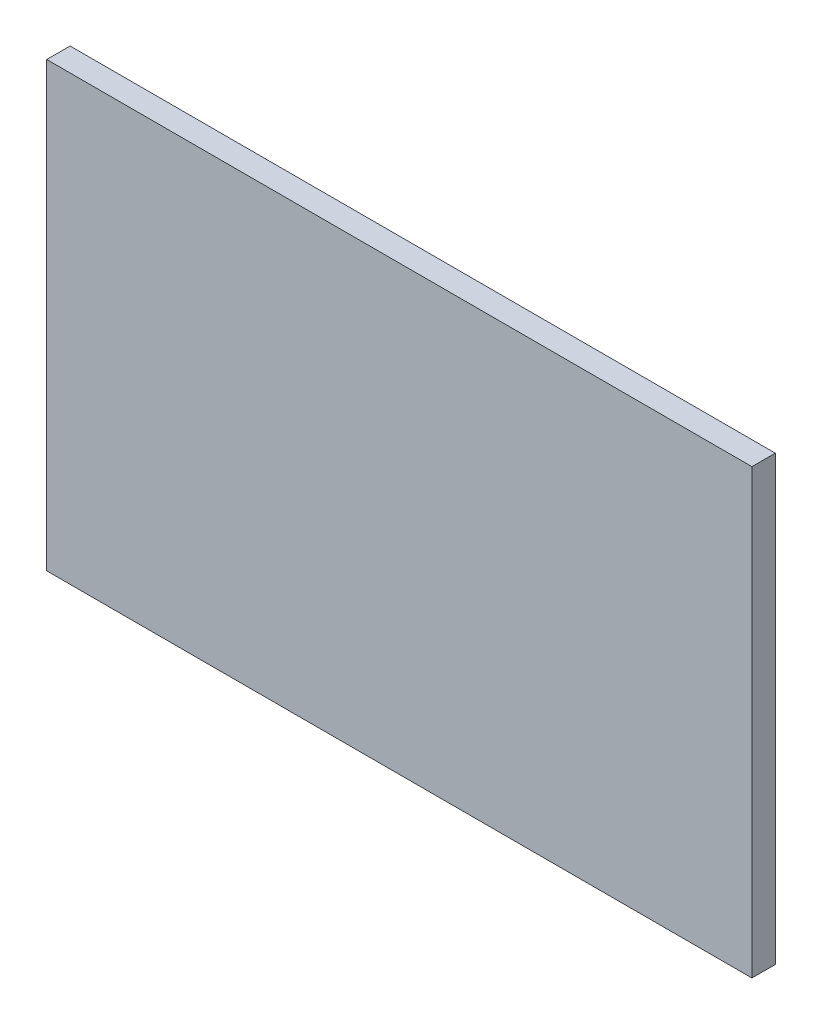
ISO-10303-21;
HEADER;
FILE_DESCRIPTION(('STEP AP214'),'2;1');
FILE_NAME('part.step','',(''),(''),'','','');
FILE_SCHEMA(('AUTOMOTIVE_DESIGN { 1 0 10303 214 1 1 1 1 }'));
ENDSEC;
DATA;
#1=APPLICATION_CONTEXT('core data for automotive mechanical design processes');
#2=APPLICATION_PROTOCOL_DEFINITION('international standard','automotive_design',2000,#1);
#3=PRODUCT_CONTEXT('',#1,'mechanical');
#4=PRODUCT('Part','Part','',(#3));
#5=PRODUCT_RELATED_PRODUCT_CATEGORY('part','',(#4));
#6=PRODUCT_DEFINITION_FORMATION('','',#4);
#7=PRODUCT_DEFINITION_CONTEXT('part definition',#1,'design');
#8=PRODUCT_DEFINITION('design','',#6,#7);
#9=PRODUCT_DEFINITION_SHAPE('','',#8);
#10=(LENGTH_UNIT() NAMED_UNIT(*) SI_UNIT(.MILLI.,.METRE.));
#11=(NAMED_UNIT(*) PLANE_ANGLE_UNIT() SI_UNIT($,.RADIAN.));
#12=(NAMED_UNIT(*) SI_UNIT($,.STERADIAN.) SOLID_ANGLE_UNIT());
#13=UNCERTAINTY_MEASURE_WITH_UNIT(LENGTH_MEASURE(1.E-05),#10,'distance_accuracy_value','');
#14=(GEOMETRIC_REPRESENTATION_CONTEXT(3) GLOBAL_UNCERTAINTY_ASSIGNED_CONTEXT((#13)) GLOBAL_UNIT_ASSIGNED_CONTEXT((#10,
#11,#12)) REPRESENTATION_CONTEXT('',''));
#15=CARTESIAN_POINT('',(0.,0.,0.));
#16=DIRECTION('',(0.,0.,1.));
#17=DIRECTION('',(1.,0.,0.));
#18=AXIS2_PLACEMENT_3D('',#15,#16,#17);
#19=CARTESIAN_POINT('',(51.6279113349427,39.9416384377561,114.017510674416));
#20=DIRECTION('',(-1.,0.,0.));
#21=DIRECTION('',(0.,-1.,0.));
#22=AXIS2_PLACEMENT_3D('',#19,#20,#21);
#23=PLANE('',#22);
#24=DIRECTION('',(0.,-1.,0.));
#25=VECTOR('',#24,1.);
#26=CARTESIAN_POINT('',(51.6279113349427,39.9416384377561,118.017510674416));
#27=LINE('',#26,#25);
#28=CARTESIAN_POINT('',(51.6279113349427,39.9416384377561,118.017510674416));
#29=VERTEX_POINT('',#28);
#30=CARTESIAN_POINT('',(51.6279113349427,-35.8583615622439,118.017510674416));
#31=VERTEX_POINT('',#30);
#32=EDGE_CURVE('E99',#29,#31,#27,.T.);
#33=ORIENTED_EDGE('',*,*,#32,.T.);
#34=DIRECTION('',(0.,0.,1.));
#35=VECTOR('',#34,1.);
#36=CARTESIAN_POINT('',(51.6279113349427,-35.8583615622439,114.017510674416));
#37=LINE('',#36,#35);
#38=CARTESIAN_POINT('',(51.6279113349427,-35.8583615622439,114.017510674416));
#39=VERTEX_POINT('',#38);
#40=EDGE_CURVE('E11',#39,#31,#37,.T.);
#41=ORIENTED_EDGE('',*,*,#40,.F.);
#42=DIRECTION('',(0.,-1.,0.));
#43=VECTOR('',#42,1.);
#44=CARTESIAN_POINT('',(51.6279113349427,39.9416384377561,114.017510674416));
#45=LINE('',#44,#43);
#46=CARTESIAN_POINT('',(51.6279113349427,39.9416384377561,114.017510674416));
#47=VERTEX_POINT('',#46);
#48=EDGE_CURVE('E87',#47,#39,#45,.T.);
#49=ORIENTED_EDGE('',*,*,#48,.F.);
#50=DIRECTION('',(0.,0.,1.));
#51=VECTOR('',#50,1.);
#52=CARTESIAN_POINT('',(51.6279113349427,39.9416384377561,114.017510674416));
#53=LINE('',#52,#51);
#54=EDGE_CURVE('E95',#47,#29,#53,.T.);
#55=ORIENTED_EDGE('',*,*,#54,.T.);
#56=EDGE_LOOP('',(#33,#41,#49,#55));
#57=FACE_BOUND('',#56,.T.);
#58=ADVANCED_FACE('F36',(#57),#23,.F.);
#59=CARTESIAN_POINT('',(-69.0720886650574,-35.8583615622439,114.017510674416));
#60=DIRECTION('',(0.,1.,0.));
#61=DIRECTION('',(-1.,0.,0.));
#62=AXIS2_PLACEMENT_3D('',#59,#60,#61);
#63=PLANE('',#62);
#64=DIRECTION('',(-1.,0.,0.));
#65=VECTOR('',#64,1.);
#66=CARTESIAN_POINT('',(-69.0720886650574,-35.8583615622439,118.017510674416));
#67=LINE('',#66,#65);
#68=CARTESIAN_POINT('',(-69.0720886650574,-35.8583615622439,118.017510674416));
#69=VERTEX_POINT('',#68);
#70=EDGE_CURVE('E91',#31,#69,#67,.T.);
#71=ORIENTED_EDGE('',*,*,#70,.T.);
#72=DIRECTION('',(0.,0.,1.));
#73=VECTOR('',#72,1.);
#74=CARTESIAN_POINT('',(-69.0720886650574,-35.8583615622439,114.017510674416));
#75=LINE('',#74,#73);
#76=CARTESIAN_POINT('',(-69.0720886650574,-35.8583615622439,114.017510674416));
#77=VERTEX_POINT('',#76);
#78=EDGE_CURVE('E44',#77,#69,#75,.T.);
#79=ORIENTED_EDGE('',*,*,#78,.F.);
#80=DIRECTION('',(-1.,0.,0.));
#81=VECTOR('',#80,1.);
#82=CARTESIAN_POINT('',(-69.0720886650574,-35.8583615622439,114.017510674416));
#83=LINE('',#82,#81);
#84=EDGE_CURVE('E82',#39,#77,#83,.T.);
#85=ORIENTED_EDGE('',*,*,#84,.F.);
#86=ORIENTED_EDGE('',*,*,#40,.T.);
#87=EDGE_LOOP('',(#71,#79,#85,#86));
#88=FACE_BOUND('',#87,.T.);
#89=ADVANCED_FACE('F90',(#88),#63,.F.);
#90=CARTESIAN_POINT('',(-69.0720886650573,39.9416384377561,114.017510674416));
#91=DIRECTION('',(1.,0.,0.));
#92=DIRECTION('',(0.,1.,0.));
#93=AXIS2_PLACEMENT_3D('',#90,#91,#92);
#94=PLANE('',#93);
#95=DIRECTION('',(0.,1.,0.));
#96=VECTOR('',#95,1.);
#97=CARTESIAN_POINT('',(-69.0720886650573,39.9416384377561,118.017510674416));
#98=LINE('',#97,#96);
#99=CARTESIAN_POINT('',(-69.0720886650573,39.9416384377561,118.017510674416));
#100=VERTEX_POINT('',#99);
#101=EDGE_CURVE('E69',#69,#100,#98,.T.);
#102=ORIENTED_EDGE('',*,*,#101,.T.);
#103=DIRECTION('',(0.,0.,1.));
#104=VECTOR('',#103,1.);
#105=CARTESIAN_POINT('',(-69.0720886650573,39.9416384377561,114.017510674416));
#106=LINE('',#105,#104);
#107=CARTESIAN_POINT('',(-69.0720886650573,39.9416384377561,114.017510674416));
#108=VERTEX_POINT('',#107);
#109=EDGE_CURVE('E92',#108,#100,#106,.T.);
#110=ORIENTED_EDGE('',*,*,#109,.F.);
#111=DIRECTION('',(0.,1.,0.));
#112=VECTOR('',#111,1.);
#113=CARTESIAN_POINT('',(-69.0720886650573,39.9416384377561,114.017510674416));
#114=LINE('',#113,#112);
#115=EDGE_CURVE('E85',#77,#108,#114,.T.);
#116=ORIENTED_EDGE('',*,*,#115,.F.);
#117=ORIENTED_EDGE('',*,*,#78,.T.);
#118=EDGE_LOOP('',(#102,#110,#116,#117));
#119=FACE_BOUND('',#118,.T.);
#120=ADVANCED_FACE('F93',(#119),#94,.F.);
#121=CARTESIAN_POINT('',(-69.0720886650573,39.9416384377561,114.017510674416));
#122=DIRECTION('',(0.,-1.,0.));
#123=DIRECTION('',(1.,0.,0.));
#124=AXIS2_PLACEMENT_3D('',#121,#122,#123);
#125=PLANE('',#124);
#126=DIRECTION('',(1.,0.,0.));
#127=VECTOR('',#126,1.);
#128=CARTESIAN_POINT('',(-69.0720886650573,39.9416384377561,118.017510674416));
#129=LINE('',#128,#127);
#130=EDGE_CURVE('E75',#100,#29,#129,.T.);
#131=ORIENTED_EDGE('',*,*,#130,.T.);
#132=ORIENTED_EDGE('',*,*,#54,.F.);
#133=DIRECTION('',(1.,0.,0.));
#134=VECTOR('',#133,1.);
#135=CARTESIAN_POINT('',(-69.0720886650573,39.9416384377561,114.017510674416));
#136=LINE('',#135,#134);
#137=EDGE_CURVE('E52',#108,#47,#136,.T.);
#138=ORIENTED_EDGE('',*,*,#137,.F.);
#139=ORIENTED_EDGE('',*,*,#109,.T.);
#140=EDGE_LOOP('',(#131,#132,#138,#139));
#141=FACE_BOUND('',#140,.T.);
#142=ADVANCED_FACE('F106',(#141),#125,.F.);
#143=CARTESIAN_POINT('',(0.,0.,114.017510674416));
#144=DIRECTION('',(0.,0.,1.));
#145=DIRECTION('',(1.,0.,0.));
#146=AXIS2_PLACEMENT_3D('',#143,#144,#145);
#147=PLANE('',#146);
#148=ORIENTED_EDGE('',*,*,#48,.T.);
#149=ORIENTED_EDGE('',*,*,#84,.T.);
#150=ORIENTED_EDGE('',*,*,#115,.T.);
#151=ORIENTED_EDGE('',*,*,#137,.T.);
#152=EDGE_LOOP('',(#148,#149,#150,#151));
#153=FACE_BOUND('',#152,.T.);
#154=ADVANCED_FACE('F83',(#153),#147,.F.);
#155=CARTESIAN_POINT('',(0.,0.,118.017510674416));
#156=DIRECTION('',(0.,0.,1.));
#157=DIRECTION('',(1.,0.,0.));
#158=AXIS2_PLACEMENT_3D('',#155,#156,#157);
#159=PLANE('',#158);
#160=ORIENTED_EDGE('',*,*,#32,.F.);
#161=ORIENTED_EDGE('',*,*,#130,.F.);
#162=ORIENTED_EDGE('',*,*,#101,.F.);
#163=ORIENTED_EDGE('',*,*,#70,.F.);
#164=EDGE_LOOP('',(#160,#161,#162,#163));
#165=FACE_BOUND('',#164,.T.);
#166=ADVANCED_FACE('F109',(#165),#159,.T.);
#167=CLOSED_SHELL('',(#58,#89,#120,#142,#154,#166));
#168=MANIFOLD_SOLID_BREP('B2',#167);
#169=ADVANCED_BREP_SHAPE_REPRESENTATION('',(#18,#168),#14);
#170=SHAPE_DEFINITION_REPRESENTATION(#9,#169);
ENDSEC;
END-ISO-10303-21;
